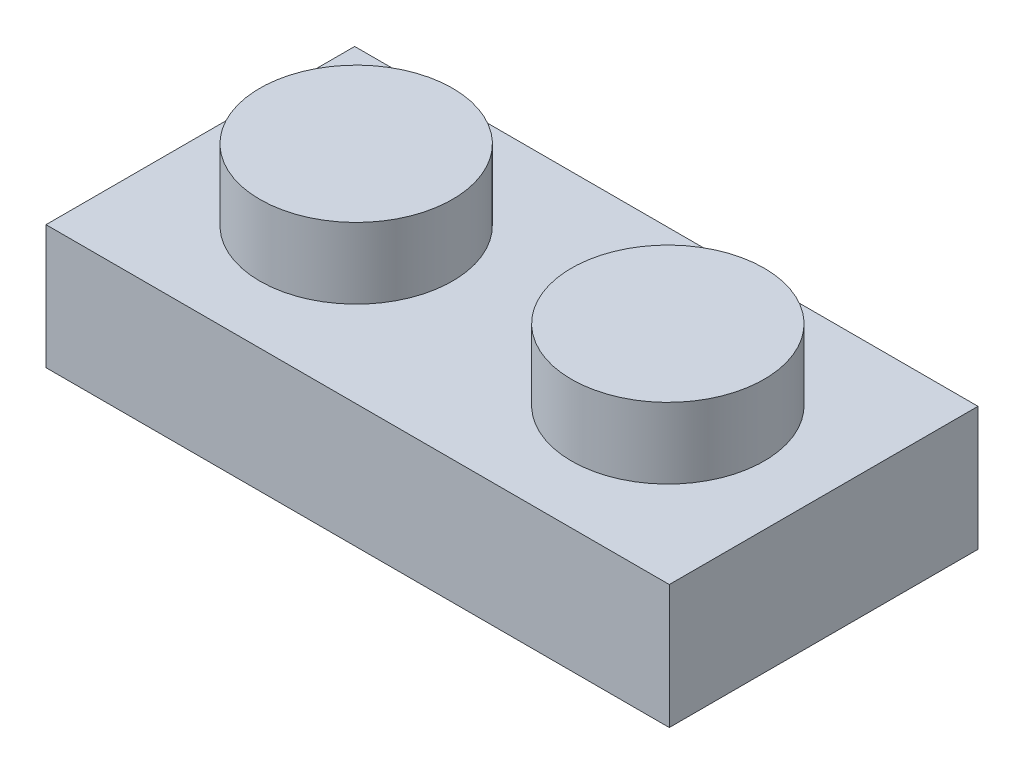
ISO-10303-21;
HEADER;
FILE_DESCRIPTION(('STEP AP214'),'2;1');
FILE_NAME('part.step','',(''),(''),'','','');
FILE_SCHEMA(('AUTOMOTIVE_DESIGN { 1 0 10303 214 1 1 1 1 }'));
ENDSEC;
DATA;
#1=APPLICATION_CONTEXT('core data for automotive mechanical design processes');
#2=APPLICATION_PROTOCOL_DEFINITION('international standard','automotive_design',2000,#1);
#3=PRODUCT_CONTEXT('',#1,'mechanical');
#4=PRODUCT('Part','Part','',(#3));
#5=PRODUCT_RELATED_PRODUCT_CATEGORY('part','',(#4));
#6=PRODUCT_DEFINITION_FORMATION('','',#4);
#7=PRODUCT_DEFINITION_CONTEXT('part definition',#1,'design');
#8=PRODUCT_DEFINITION('design','',#6,#7);
#9=PRODUCT_DEFINITION_SHAPE('','',#8);
#10=(LENGTH_UNIT() NAMED_UNIT(*) SI_UNIT(.MILLI.,.METRE.));
#11=(NAMED_UNIT(*) PLANE_ANGLE_UNIT() SI_UNIT($,.RADIAN.));
#12=(NAMED_UNIT(*) SI_UNIT($,.STERADIAN.) SOLID_ANGLE_UNIT());
#13=UNCERTAINTY_MEASURE_WITH_UNIT(LENGTH_MEASURE(1.E-05),#10,'distance_accuracy_value','');
#14=(GEOMETRIC_REPRESENTATION_CONTEXT(3) GLOBAL_UNCERTAINTY_ASSIGNED_CONTEXT((#13)) GLOBAL_UNIT_ASSIGNED_CONTEXT((#10,
#11,#12)) REPRESENTATION_CONTEXT('',''));
#15=CARTESIAN_POINT('',(0.,0.,0.));
#16=DIRECTION('',(0.,0.,1.));
#17=DIRECTION('',(1.,0.,0.));
#18=AXIS2_PLACEMENT_3D('',#15,#16,#17);
#19=CARTESIAN_POINT('',(7.925,-3.15,-3.925));
#20=DIRECTION('',(1.,0.,0.));
#21=DIRECTION('',(0.,0.,-1.));
#22=AXIS2_PLACEMENT_3D('',#19,#20,#21);
#23=PLANE('',#22);
#24=DIRECTION('',(0.,0.,-1.));
#25=VECTOR('',#24,1.);
#26=CARTESIAN_POINT('',(7.925,0.,-3.925));
#27=LINE('',#26,#25);
#28=CARTESIAN_POINT('',(7.925,0.,3.925));
#29=VERTEX_POINT('',#28);
#30=CARTESIAN_POINT('',(7.925,0.,-3.925));
#31=VERTEX_POINT('',#30);
#32=EDGE_CURVE('E170',#29,#31,#27,.T.);
#33=ORIENTED_EDGE('',*,*,#32,.F.);
#34=DIRECTION('',(0.,1.,0.));
#35=VECTOR('',#34,1.);
#36=CARTESIAN_POINT('',(7.925,-3.15,3.925));
#37=LINE('',#36,#35);
#38=CARTESIAN_POINT('',(7.925,-3.15,3.925));
#39=VERTEX_POINT('',#38);
#40=EDGE_CURVE('E42',#39,#29,#37,.T.);
#41=ORIENTED_EDGE('',*,*,#40,.F.);
#42=DIRECTION('',(0.,0.,-1.));
#43=VECTOR('',#42,1.);
#44=CARTESIAN_POINT('',(7.925,-3.15,-3.925));
#45=LINE('',#44,#43);
#46=CARTESIAN_POINT('',(7.925,-3.15,-3.925));
#47=VERTEX_POINT('',#46);
#48=EDGE_CURVE('E173',#39,#47,#45,.T.);
#49=ORIENTED_EDGE('',*,*,#48,.T.);
#50=DIRECTION('',(0.,1.,0.));
#51=VECTOR('',#50,1.);
#52=CARTESIAN_POINT('',(7.925,-3.15,-3.925));
#53=LINE('',#52,#51);
#54=EDGE_CURVE('E83',#47,#31,#53,.T.);
#55=ORIENTED_EDGE('',*,*,#54,.T.);
#56=EDGE_LOOP('',(#33,#41,#49,#55));
#57=FACE_BOUND('',#56,.T.);
#58=ADVANCED_FACE('F35',(#57),#23,.T.);
#59=CARTESIAN_POINT('',(-7.925,-3.15,3.925));
#60=DIRECTION('',(0.,0.,1.));
#61=DIRECTION('',(1.,0.,0.));
#62=AXIS2_PLACEMENT_3D('',#59,#60,#61);
#63=PLANE('',#62);
#64=DIRECTION('',(1.,0.,0.));
#65=VECTOR('',#64,1.);
#66=CARTESIAN_POINT('',(-7.925,0.,3.925));
#67=LINE('',#66,#65);
#68=CARTESIAN_POINT('',(-7.925,0.,3.925));
#69=VERTEX_POINT('',#68);
#70=EDGE_CURVE('E176',#69,#29,#67,.T.);
#71=ORIENTED_EDGE('',*,*,#70,.F.);
#72=DIRECTION('',(0.,1.,0.));
#73=VECTOR('',#72,1.);
#74=CARTESIAN_POINT('',(-7.925,-3.15,3.925));
#75=LINE('',#74,#73);
#76=CARTESIAN_POINT('',(-7.925,-3.15,3.925));
#77=VERTEX_POINT('',#76);
#78=EDGE_CURVE('E194',#77,#69,#75,.T.);
#79=ORIENTED_EDGE('',*,*,#78,.F.);
#80=DIRECTION('',(1.,0.,0.));
#81=VECTOR('',#80,1.);
#82=CARTESIAN_POINT('',(-7.925,-3.15,3.925));
#83=LINE('',#82,#81);
#84=EDGE_CURVE('E181',#77,#39,#83,.T.);
#85=ORIENTED_EDGE('',*,*,#84,.T.);
#86=ORIENTED_EDGE('',*,*,#40,.T.);
#87=EDGE_LOOP('',(#71,#79,#85,#86));
#88=FACE_BOUND('',#87,.T.);
#89=ADVANCED_FACE('F201',(#88),#63,.T.);
#90=CARTESIAN_POINT('',(-7.925,-3.15,-3.925));
#91=DIRECTION('',(-1.,0.,0.));
#92=DIRECTION('',(0.,0.,1.));
#93=AXIS2_PLACEMENT_3D('',#90,#91,#92);
#94=PLANE('',#93);
#95=DIRECTION('',(0.,0.,1.));
#96=VECTOR('',#95,1.);
#97=CARTESIAN_POINT('',(-7.925,0.,-3.925));
#98=LINE('',#97,#96);
#99=CARTESIAN_POINT('',(-7.925,0.,-3.925));
#100=VERTEX_POINT('',#99);
#101=EDGE_CURVE('E188',#100,#69,#98,.T.);
#102=ORIENTED_EDGE('',*,*,#101,.F.);
#103=DIRECTION('',(0.,1.,0.));
#104=VECTOR('',#103,1.);
#105=CARTESIAN_POINT('',(-7.925,-3.15,-3.925));
#106=LINE('',#105,#104);
#107=CARTESIAN_POINT('',(-7.925,-3.15,-3.925));
#108=VERTEX_POINT('',#107);
#109=EDGE_CURVE('E196',#108,#100,#106,.T.);
#110=ORIENTED_EDGE('',*,*,#109,.F.);
#111=DIRECTION('',(0.,0.,1.));
#112=VECTOR('',#111,1.);
#113=CARTESIAN_POINT('',(-7.925,-3.15,-3.925));
#114=LINE('',#113,#112);
#115=EDGE_CURVE('E178',#108,#77,#114,.T.);
#116=ORIENTED_EDGE('',*,*,#115,.T.);
#117=ORIENTED_EDGE('',*,*,#78,.T.);
#118=EDGE_LOOP('',(#102,#110,#116,#117));
#119=FACE_BOUND('',#118,.T.);
#120=ADVANCED_FACE('F205',(#119),#94,.T.);
#121=CARTESIAN_POINT('',(-7.925,-3.15,-3.925));
#122=DIRECTION('',(0.,0.,-1.));
#123=DIRECTION('',(-1.,0.,0.));
#124=AXIS2_PLACEMENT_3D('',#121,#122,#123);
#125=PLANE('',#124);
#126=DIRECTION('',(-1.,0.,0.));
#127=VECTOR('',#126,1.);
#128=CARTESIAN_POINT('',(-7.925,0.,-3.925));
#129=LINE('',#128,#127);
#130=EDGE_CURVE('E185',#31,#100,#129,.T.);
#131=ORIENTED_EDGE('',*,*,#130,.F.);
#132=ORIENTED_EDGE('',*,*,#54,.F.);
#133=DIRECTION('',(-1.,0.,0.));
#134=VECTOR('',#133,1.);
#135=CARTESIAN_POINT('',(-7.925,-3.15,-3.925));
#136=LINE('',#135,#134);
#137=EDGE_CURVE('E175',#47,#108,#136,.T.);
#138=ORIENTED_EDGE('',*,*,#137,.T.);
#139=ORIENTED_EDGE('',*,*,#109,.T.);
#140=EDGE_LOOP('',(#131,#132,#138,#139));
#141=FACE_BOUND('',#140,.T.);
#142=ADVANCED_FACE('F197',(#141),#125,.T.);
#143=CARTESIAN_POINT('',(0.,-3.15,0.));
#144=DIRECTION('',(0.,1.,0.));
#145=DIRECTION('',(0.,0.,1.));
#146=AXIS2_PLACEMENT_3D('',#143,#144,#145);
#147=PLANE('',#146);
#148=DIRECTION('',(1.,0.,0.));
#149=VECTOR('',#148,1.);
#150=CARTESIAN_POINT('',(0.,-3.15,2.425));
#151=LINE('',#150,#149);
#152=CARTESIAN_POINT('',(-6.425,-3.15,2.425));
#153=VERTEX_POINT('',#152);
#154=CARTESIAN_POINT('',(6.425,-3.15,2.425));
#155=VERTEX_POINT('',#154);
#156=EDGE_CURVE('E156',#153,#155,#151,.T.);
#157=ORIENTED_EDGE('',*,*,#156,.T.);
#158=DIRECTION('',(0.,0.,-1.));
#159=VECTOR('',#158,1.);
#160=CARTESIAN_POINT('',(6.425,-3.15,0.));
#161=LINE('',#160,#159);
#162=CARTESIAN_POINT('',(6.425,-3.15,-2.425));
#163=VERTEX_POINT('',#162);
#164=EDGE_CURVE('E112',#155,#163,#161,.T.);
#165=ORIENTED_EDGE('',*,*,#164,.T.);
#166=DIRECTION('',(-1.,0.,0.));
#167=VECTOR('',#166,1.);
#168=CARTESIAN_POINT('',(0.,-3.15,-2.425));
#169=LINE('',#168,#167);
#170=CARTESIAN_POINT('',(-6.425,-3.15,-2.425));
#171=VERTEX_POINT('',#170);
#172=EDGE_CURVE('E134',#163,#171,#169,.T.);
#173=ORIENTED_EDGE('',*,*,#172,.T.);
#174=DIRECTION('',(0.,0.,1.));
#175=VECTOR('',#174,1.);
#176=CARTESIAN_POINT('',(-6.425,-3.15,0.));
#177=LINE('',#176,#175);
#178=EDGE_CURVE('E49',#171,#153,#177,.T.);
#179=ORIENTED_EDGE('',*,*,#178,.T.);
#180=EDGE_LOOP('',(#157,#165,#173,#179));
#181=FACE_BOUND('',#180,.T.);
#182=ORIENTED_EDGE('',*,*,#48,.F.);
#183=ORIENTED_EDGE('',*,*,#84,.F.);
#184=ORIENTED_EDGE('',*,*,#115,.F.);
#185=ORIENTED_EDGE('',*,*,#137,.F.);
#186=EDGE_LOOP('',(#182,#183,#184,#185));
#187=FACE_BOUND('',#186,.T.);
#188=ADVANCED_FACE('F207',(#181,#187),#147,.F.);
#189=CARTESIAN_POINT('',(0.,0.,0.));
#190=DIRECTION('',(0.,1.,0.));
#191=DIRECTION('',(0.,0.,1.));
#192=AXIS2_PLACEMENT_3D('',#189,#190,#191);
#193=PLANE('',#192);
#194=CARTESIAN_POINT('',(3.9625,0.,0.));
#195=DIRECTION('',(0.,1.,0.));
#196=DIRECTION('',(0.,0.,1.));
#197=AXIS2_PLACEMENT_3D('',#194,#195,#196);
#198=CIRCLE('',#197,2.45);
#199=CARTESIAN_POINT('',(3.9625,0.,2.45));
#200=VERTEX_POINT('',#199);
#201=EDGE_CURVE('E117',#200,#200,#198,.T.);
#202=ORIENTED_EDGE('',*,*,#201,.F.);
#203=EDGE_LOOP('',(#202));
#204=FACE_BOUND('',#203,.T.);
#205=CARTESIAN_POINT('',(-3.9625,0.,0.));
#206=DIRECTION('',(0.,1.,0.));
#207=DIRECTION('',(0.,0.,1.));
#208=AXIS2_PLACEMENT_3D('',#205,#206,#207);
#209=CIRCLE('',#208,2.45);
#210=CARTESIAN_POINT('',(-3.9625,0.,2.45));
#211=VERTEX_POINT('',#210);
#212=EDGE_CURVE('E164',#211,#211,#209,.T.);
#213=ORIENTED_EDGE('',*,*,#212,.F.);
#214=EDGE_LOOP('',(#213));
#215=FACE_BOUND('',#214,.T.);
#216=ORIENTED_EDGE('',*,*,#32,.T.);
#217=ORIENTED_EDGE('',*,*,#130,.T.);
#218=ORIENTED_EDGE('',*,*,#101,.T.);
#219=ORIENTED_EDGE('',*,*,#70,.T.);
#220=EDGE_LOOP('',(#216,#217,#218,#219));
#221=FACE_BOUND('',#220,.T.);
#222=ADVANCED_FACE('F200',(#204,#215,#221),#193,.T.);
#223=CARTESIAN_POINT('',(-3.9625,1.8,0.));
#224=DIRECTION('',(0.,-1.,0.));
#225=DIRECTION('',(0.,0.,-1.));
#226=AXIS2_PLACEMENT_3D('',#223,#224,#225);
#227=CYLINDRICAL_SURFACE('',#226,2.45);
#228=CARTESIAN_POINT('',(-3.9625,1.8,0.));
#229=DIRECTION('',(0.,1.,0.));
#230=DIRECTION('',(0.,0.,1.));
#231=AXIS2_PLACEMENT_3D('',#228,#229,#230);
#232=CIRCLE('',#231,2.45);
#233=CARTESIAN_POINT('',(-3.9625,1.8,2.45));
#234=VERTEX_POINT('',#233);
#235=EDGE_CURVE('E167',#234,#234,#232,.T.);
#236=ORIENTED_EDGE('',*,*,#235,.F.);
#237=EDGE_LOOP('',(#236));
#238=FACE_BOUND('',#237,.T.);
#239=ORIENTED_EDGE('',*,*,#212,.T.);
#240=EDGE_LOOP('',(#239));
#241=FACE_BOUND('',#240,.T.);
#242=ADVANCED_FACE('F215',(#238,#241),#227,.T.);
#243=CARTESIAN_POINT('',(-3.9625,1.8,0.));
#244=DIRECTION('',(0.,1.,0.));
#245=DIRECTION('',(0.,0.,1.));
#246=AXIS2_PLACEMENT_3D('',#243,#244,#245);
#247=PLANE('',#246);
#248=ORIENTED_EDGE('',*,*,#235,.T.);
#249=EDGE_LOOP('',(#248));
#250=FACE_BOUND('',#249,.T.);
#251=ADVANCED_FACE('F250',(#250),#247,.T.);
#252=CARTESIAN_POINT('',(3.9625,1.8,0.));
#253=DIRECTION('',(0.,-1.,0.));
#254=DIRECTION('',(0.,0.,-1.));
#255=AXIS2_PLACEMENT_3D('',#252,#253,#254);
#256=CYLINDRICAL_SURFACE('',#255,2.45);
#257=CARTESIAN_POINT('',(3.9625,1.8,0.));
#258=DIRECTION('',(0.,1.,0.));
#259=DIRECTION('',(0.,0.,1.));
#260=AXIS2_PLACEMENT_3D('',#257,#258,#259);
#261=CIRCLE('',#260,2.45);
#262=CARTESIAN_POINT('',(3.9625,1.8,2.45));
#263=VERTEX_POINT('',#262);
#264=EDGE_CURVE('E161',#263,#263,#261,.T.);
#265=ORIENTED_EDGE('',*,*,#264,.F.);
#266=EDGE_LOOP('',(#265));
#267=FACE_BOUND('',#266,.T.);
#268=ORIENTED_EDGE('',*,*,#201,.T.);
#269=EDGE_LOOP('',(#268));
#270=FACE_BOUND('',#269,.T.);
#271=ADVANCED_FACE('F259',(#267,#270),#256,.T.);
#272=CARTESIAN_POINT('',(3.9625,1.8,0.));
#273=DIRECTION('',(0.,1.,0.));
#274=DIRECTION('',(0.,0.,1.));
#275=AXIS2_PLACEMENT_3D('',#272,#273,#274);
#276=PLANE('',#275);
#277=ORIENTED_EDGE('',*,*,#264,.T.);
#278=EDGE_LOOP('',(#277));
#279=FACE_BOUND('',#278,.T.);
#280=ADVANCED_FACE('F269',(#279),#276,.T.);
#281=CARTESIAN_POINT('',(6.425,-3.15,-3.925));
#282=DIRECTION('',(1.,0.,0.));
#283=DIRECTION('',(0.,0.,-1.));
#284=AXIS2_PLACEMENT_3D('',#281,#282,#283);
#285=PLANE('',#284);
#286=DIRECTION('',(0.,0.,-1.));
#287=VECTOR('',#286,1.);
#288=CARTESIAN_POINT('',(6.425,-1.5,0.));
#289=LINE('',#288,#287);
#290=CARTESIAN_POINT('',(6.425,-1.5,2.425));
#291=VERTEX_POINT('',#290);
#292=CARTESIAN_POINT('',(6.425,-1.5,-2.425));
#293=VERTEX_POINT('',#292);
#294=EDGE_CURVE('E110',#291,#293,#289,.T.);
#295=ORIENTED_EDGE('',*,*,#294,.T.);
#296=DIRECTION('',(0.,1.,0.));
#297=VECTOR('',#296,1.);
#298=CARTESIAN_POINT('',(6.425,-3.15,-2.425));
#299=LINE('',#298,#297);
#300=EDGE_CURVE('E139',#163,#293,#299,.T.);
#301=ORIENTED_EDGE('',*,*,#300,.F.);
#302=ORIENTED_EDGE('',*,*,#164,.F.);
#303=DIRECTION('',(0.,1.,0.));
#304=VECTOR('',#303,1.);
#305=CARTESIAN_POINT('',(6.425,-3.15,2.425));
#306=LINE('',#305,#304);
#307=EDGE_CURVE('E107',#155,#291,#306,.T.);
#308=ORIENTED_EDGE('',*,*,#307,.T.);
#309=EDGE_LOOP('',(#295,#301,#302,#308));
#310=FACE_BOUND('',#309,.T.);
#311=ADVANCED_FACE('F109',(#310),#285,.F.);
#312=CARTESIAN_POINT('',(-7.925,-3.15,2.425));
#313=DIRECTION('',(0.,0.,1.));
#314=DIRECTION('',(1.,0.,0.));
#315=AXIS2_PLACEMENT_3D('',#312,#313,#314);
#316=PLANE('',#315);
#317=DIRECTION('',(1.,0.,0.));
#318=VECTOR('',#317,1.);
#319=CARTESIAN_POINT('',(0.,-1.5,2.425));
#320=LINE('',#319,#318);
#321=CARTESIAN_POINT('',(-6.425,-1.5,2.425));
#322=VERTEX_POINT('',#321);
#323=EDGE_CURVE('E125',#322,#291,#320,.T.);
#324=ORIENTED_EDGE('',*,*,#323,.T.);
#325=ORIENTED_EDGE('',*,*,#307,.F.);
#326=ORIENTED_EDGE('',*,*,#156,.F.);
#327=DIRECTION('',(0.,1.,0.));
#328=VECTOR('',#327,1.);
#329=CARTESIAN_POINT('',(-6.425,-3.15,2.425));
#330=LINE('',#329,#328);
#331=EDGE_CURVE('E118',#153,#322,#330,.T.);
#332=ORIENTED_EDGE('',*,*,#331,.T.);
#333=EDGE_LOOP('',(#324,#325,#326,#332));
#334=FACE_BOUND('',#333,.T.);
#335=ADVANCED_FACE('F130',(#334),#316,.F.);
#336=CARTESIAN_POINT('',(-6.425,-3.15,-3.925));
#337=DIRECTION('',(-1.,0.,0.));
#338=DIRECTION('',(0.,0.,1.));
#339=AXIS2_PLACEMENT_3D('',#336,#337,#338);
#340=PLANE('',#339);
#341=DIRECTION('',(0.,0.,1.));
#342=VECTOR('',#341,1.);
#343=CARTESIAN_POINT('',(-6.425,-1.5,0.));
#344=LINE('',#343,#342);
#345=CARTESIAN_POINT('',(-6.425,-1.5,-2.425));
#346=VERTEX_POINT('',#345);
#347=EDGE_CURVE('E132',#346,#322,#344,.T.);
#348=ORIENTED_EDGE('',*,*,#347,.T.);
#349=ORIENTED_EDGE('',*,*,#331,.F.);
#350=ORIENTED_EDGE('',*,*,#178,.F.);
#351=DIRECTION('',(0.,1.,0.));
#352=VECTOR('',#351,1.);
#353=CARTESIAN_POINT('',(-6.425,-3.15,-2.425));
#354=LINE('',#353,#352);
#355=EDGE_CURVE('E140',#171,#346,#354,.T.);
#356=ORIENTED_EDGE('',*,*,#355,.T.);
#357=EDGE_LOOP('',(#348,#349,#350,#356));
#358=FACE_BOUND('',#357,.T.);
#359=ADVANCED_FACE('F299',(#358),#340,.F.);
#360=CARTESIAN_POINT('',(-7.925,-3.15,-2.425));
#361=DIRECTION('',(0.,0.,-1.));
#362=DIRECTION('',(-1.,0.,0.));
#363=AXIS2_PLACEMENT_3D('',#360,#361,#362);
#364=PLANE('',#363);
#365=DIRECTION('',(-1.,0.,0.));
#366=VECTOR('',#365,1.);
#367=CARTESIAN_POINT('',(0.,-1.5,-2.425));
#368=LINE('',#367,#366);
#369=EDGE_CURVE('E127',#293,#346,#368,.T.);
#370=ORIENTED_EDGE('',*,*,#369,.T.);
#371=ORIENTED_EDGE('',*,*,#355,.F.);
#372=ORIENTED_EDGE('',*,*,#172,.F.);
#373=ORIENTED_EDGE('',*,*,#300,.T.);
#374=EDGE_LOOP('',(#370,#371,#372,#373));
#375=FACE_BOUND('',#374,.T.);
#376=ADVANCED_FACE('F308',(#375),#364,.F.);
#377=CARTESIAN_POINT('',(0.,-1.5,0.));
#378=DIRECTION('',(0.,1.,0.));
#379=DIRECTION('',(0.,0.,1.));
#380=AXIS2_PLACEMENT_3D('',#377,#378,#379);
#381=PLANE('',#380);
#382=CARTESIAN_POINT('',(0.,-1.5,0.));
#383=DIRECTION('',(0.,1.,0.));
#384=DIRECTION('',(0.,0.,1.));
#385=AXIS2_PLACEMENT_3D('',#382,#383,#384);
#386=CIRCLE('',#385,1.5);
#387=CARTESIAN_POINT('',(0.,-1.5,1.5));
#388=VERTEX_POINT('',#387);
#389=EDGE_CURVE('E12',#388,#388,#386,.F.);
#390=ORIENTED_EDGE('',*,*,#389,.F.);
#391=EDGE_LOOP('',(#390));
#392=FACE_BOUND('',#391,.T.);
#393=CARTESIAN_POINT('',(3.9625,-1.5,0.));
#394=DIRECTION('',(0.,1.,0.));
#395=DIRECTION('',(0.,0.,1.));
#396=AXIS2_PLACEMENT_3D('',#393,#394,#395);
#397=CIRCLE('',#396,0.950000000000003);
#398=CARTESIAN_POINT('',(3.9625,-1.5,0.950000000000003));
#399=VERTEX_POINT('',#398);
#400=EDGE_CURVE('E144',#399,#399,#397,.T.);
#401=ORIENTED_EDGE('',*,*,#400,.T.);
#402=EDGE_LOOP('',(#401));
#403=FACE_BOUND('',#402,.T.);
#404=CARTESIAN_POINT('',(-3.9625,-1.5,0.));
#405=DIRECTION('',(0.,1.,0.));
#406=DIRECTION('',(0.,0.,1.));
#407=AXIS2_PLACEMENT_3D('',#404,#405,#406);
#408=CIRCLE('',#407,0.950000000000001);
#409=CARTESIAN_POINT('',(-3.9625,-1.5,0.950000000000001));
#410=VERTEX_POINT('',#409);
#411=EDGE_CURVE('E149',#410,#410,#408,.T.);
#412=ORIENTED_EDGE('',*,*,#411,.T.);
#413=EDGE_LOOP('',(#412));
#414=FACE_BOUND('',#413,.T.);
#415=ORIENTED_EDGE('',*,*,#294,.F.);
#416=ORIENTED_EDGE('',*,*,#323,.F.);
#417=ORIENTED_EDGE('',*,*,#347,.F.);
#418=ORIENTED_EDGE('',*,*,#369,.F.);
#419=EDGE_LOOP('',(#415,#416,#417,#418));
#420=FACE_BOUND('',#419,.T.);
#421=ADVANCED_FACE('F123',(#392,#403,#414,#420),#381,.F.);
#422=CARTESIAN_POINT('',(-3.9625,1.8,0.));
#423=DIRECTION('',(0.,-1.,0.));
#424=DIRECTION('',(0.,0.,-1.));
#425=AXIS2_PLACEMENT_3D('',#422,#423,#424);
#426=CYLINDRICAL_SURFACE('',#425,0.950000000000001);
#427=CARTESIAN_POINT('',(-3.9625,0.3,0.));
#428=DIRECTION('',(0.,1.,0.));
#429=DIRECTION('',(0.,0.,1.));
#430=AXIS2_PLACEMENT_3D('',#427,#428,#429);
#431=CIRCLE('',#430,0.950000000000001);
#432=CARTESIAN_POINT('',(-3.9625,0.3,0.950000000000001));
#433=VERTEX_POINT('',#432);
#434=EDGE_CURVE('E128',#433,#433,#431,.T.);
#435=ORIENTED_EDGE('',*,*,#434,.T.);
#436=EDGE_LOOP('',(#435));
#437=FACE_BOUND('',#436,.T.);
#438=ORIENTED_EDGE('',*,*,#411,.F.);
#439=EDGE_LOOP('',(#438));
#440=FACE_BOUND('',#439,.T.);
#441=ADVANCED_FACE('F324',(#437,#440),#426,.F.);
#442=CARTESIAN_POINT('',(-3.9625,0.3,0.));
#443=DIRECTION('',(0.,1.,0.));
#444=DIRECTION('',(0.,0.,1.));
#445=AXIS2_PLACEMENT_3D('',#442,#443,#444);
#446=PLANE('',#445);
#447=ORIENTED_EDGE('',*,*,#434,.F.);
#448=EDGE_LOOP('',(#447));
#449=FACE_BOUND('',#448,.T.);
#450=ADVANCED_FACE('F329',(#449),#446,.F.);
#451=CARTESIAN_POINT('',(3.9625,1.8,0.));
#452=DIRECTION('',(0.,-1.,0.));
#453=DIRECTION('',(0.,0.,-1.));
#454=AXIS2_PLACEMENT_3D('',#451,#452,#453);
#455=CYLINDRICAL_SURFACE('',#454,0.950000000000003);
#456=CARTESIAN_POINT('',(3.9625,0.3,0.));
#457=DIRECTION('',(0.,1.,0.));
#458=DIRECTION('',(0.,0.,1.));
#459=AXIS2_PLACEMENT_3D('',#456,#457,#458);
#460=CIRCLE('',#459,0.950000000000003);
#461=CARTESIAN_POINT('',(3.9625,0.3,0.950000000000003));
#462=VERTEX_POINT('',#461);
#463=EDGE_CURVE('E147',#462,#462,#460,.T.);
#464=ORIENTED_EDGE('',*,*,#463,.T.);
#465=EDGE_LOOP('',(#464));
#466=FACE_BOUND('',#465,.T.);
#467=ORIENTED_EDGE('',*,*,#400,.F.);
#468=EDGE_LOOP('',(#467));
#469=FACE_BOUND('',#468,.T.);
#470=ADVANCED_FACE('F339',(#466,#469),#455,.F.);
#471=CARTESIAN_POINT('',(3.9625,0.3,0.));
#472=DIRECTION('',(0.,1.,0.));
#473=DIRECTION('',(0.,0.,1.));
#474=AXIS2_PLACEMENT_3D('',#471,#472,#473);
#475=PLANE('',#474);
#476=ORIENTED_EDGE('',*,*,#463,.F.);
#477=EDGE_LOOP('',(#476));
#478=FACE_BOUND('',#477,.T.);
#479=ADVANCED_FACE('F349',(#478),#475,.F.);
#480=CARTESIAN_POINT('',(0.,-7.39264068711929,0.));
#481=DIRECTION('',(0.,1.,0.));
#482=DIRECTION('',(0.,0.,1.));
#483=AXIS2_PLACEMENT_3D('',#480,#481,#482);
#484=CYLINDRICAL_SURFACE('',#483,1.5);
#485=CARTESIAN_POINT('',(0.,-2.95,0.));
#486=DIRECTION('',(0.,1.,0.));
#487=DIRECTION('',(0.,0.,1.));
#488=AXIS2_PLACEMENT_3D('',#485,#486,#487);
#489=CIRCLE('',#488,1.5);
#490=CARTESIAN_POINT('',(0.,-2.95,1.5));
#491=VERTEX_POINT('',#490);
#492=EDGE_CURVE('E413',#491,#491,#489,.T.);
#493=ORIENTED_EDGE('',*,*,#492,.T.);
#494=EDGE_LOOP('',(#493));
#495=FACE_BOUND('',#494,.T.);
#496=ORIENTED_EDGE('',*,*,#389,.T.);
#497=EDGE_LOOP('',(#496));
#498=FACE_BOUND('',#497,.T.);
#499=ADVANCED_FACE('F359',(#495,#498),#484,.T.);
#500=CARTESIAN_POINT('',(0.,-7.39264068711929,0.));
#501=DIRECTION('',(0.,1.,0.));
#502=DIRECTION('',(0.,0.,1.));
#503=AXIS2_PLACEMENT_3D('',#500,#501,#502);
#504=CYLINDRICAL_SURFACE('',#503,0.7);
#505=CARTESIAN_POINT('',(0.,-2.95,0.));
#506=DIRECTION('',(0.,1.,0.));
#507=DIRECTION('',(0.,0.,1.));
#508=AXIS2_PLACEMENT_3D('',#505,#506,#507);
#509=CIRCLE('',#508,0.7);
#510=CARTESIAN_POINT('',(0.,-2.95,0.7));
#511=VERTEX_POINT('',#510);
#512=EDGE_CURVE('E148',#511,#511,#509,.T.);
#513=ORIENTED_EDGE('',*,*,#512,.F.);
#514=EDGE_LOOP('',(#513));
#515=FACE_BOUND('',#514,.T.);
#516=CARTESIAN_POINT('',(0.,-1.5,0.));
#517=DIRECTION('',(0.,-1.,0.));
#518=DIRECTION('',(0.,0.,-1.));
#519=AXIS2_PLACEMENT_3D('',#516,#517,#518);
#520=CIRCLE('',#519,0.7);
#521=CARTESIAN_POINT('',(0.,-1.5,-0.7));
#522=VERTEX_POINT('',#521);
#523=EDGE_CURVE('E411',#522,#522,#520,.T.);
#524=ORIENTED_EDGE('',*,*,#523,.F.);
#525=EDGE_LOOP('',(#524));
#526=FACE_BOUND('',#525,.T.);
#527=ADVANCED_FACE('F378',(#515,#526),#504,.F.);
#528=CARTESIAN_POINT('',(0.,-2.95,0.));
#529=DIRECTION('',(0.,1.,0.));
#530=DIRECTION('',(0.,0.,1.));
#531=AXIS2_PLACEMENT_3D('',#528,#529,#530);
#532=PLANE('',#531);
#533=ORIENTED_EDGE('',*,*,#512,.T.);
#534=EDGE_LOOP('',(#533));
#535=FACE_BOUND('',#534,.T.);
#536=ORIENTED_EDGE('',*,*,#492,.F.);
#537=EDGE_LOOP('',(#536));
#538=FACE_BOUND('',#537,.T.);
#539=ADVANCED_FACE('F388',(#535,#538),#532,.F.);
#540=ORIENTED_EDGE('',*,*,#523,.T.);
#541=EDGE_LOOP('',(#540));
#542=FACE_BOUND('',#541,.T.);
#543=ADVANCED_FACE('F371',(#542),#381,.F.);
#544=CLOSED_SHELL('',(#58,#89,#120,#142,#188,#222,#242,#251,#271,#280,#311,#335,#359,#376,#421,
#441,#450,#470,#479,#499,#527,#539,#543));
#545=MANIFOLD_SOLID_BREP('B2',#544);
#546=ADVANCED_BREP_SHAPE_REPRESENTATION('',(#18,#545),#14);
#547=SHAPE_DEFINITION_REPRESENTATION(#9,#546);
ENDSEC;
END-ISO-10303-21;
